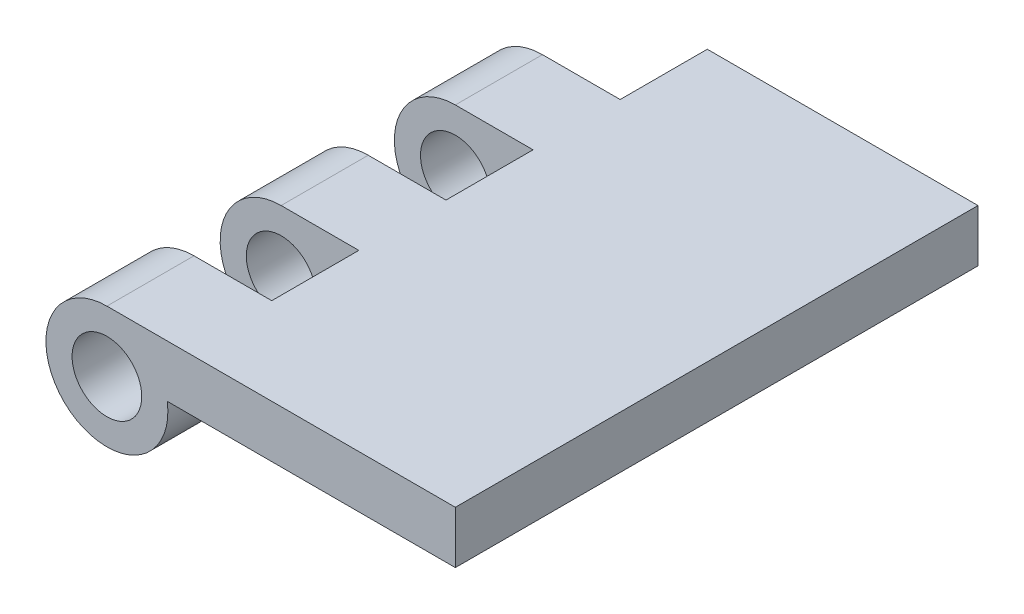
ISO-10303-21;
HEADER;
FILE_DESCRIPTION(('STEP AP214'),'2;1');
FILE_NAME('part.step','',(''),(''),'','','');
FILE_SCHEMA(('AUTOMOTIVE_DESIGN { 1 0 10303 214 1 1 1 1 }'));
ENDSEC;
DATA;
#1=APPLICATION_CONTEXT('core data for automotive mechanical design processes');
#2=APPLICATION_PROTOCOL_DEFINITION('international standard','automotive_design',2000,#1);
#3=PRODUCT_CONTEXT('',#1,'mechanical');
#4=PRODUCT('Part','Part','',(#3));
#5=PRODUCT_RELATED_PRODUCT_CATEGORY('part','',(#4));
#6=PRODUCT_DEFINITION_FORMATION('','',#4);
#7=PRODUCT_DEFINITION_CONTEXT('part definition',#1,'design');
#8=PRODUCT_DEFINITION('design','',#6,#7);
#9=PRODUCT_DEFINITION_SHAPE('','',#8);
#10=(LENGTH_UNIT() NAMED_UNIT(*) SI_UNIT(.MILLI.,.METRE.));
#11=(NAMED_UNIT(*) PLANE_ANGLE_UNIT() SI_UNIT($,.RADIAN.));
#12=(NAMED_UNIT(*) SI_UNIT($,.STERADIAN.) SOLID_ANGLE_UNIT());
#13=UNCERTAINTY_MEASURE_WITH_UNIT(LENGTH_MEASURE(1.E-05),#10,'distance_accuracy_value','');
#14=(GEOMETRIC_REPRESENTATION_CONTEXT(3) GLOBAL_UNCERTAINTY_ASSIGNED_CONTEXT((#13)) GLOBAL_UNIT_ASSIGNED_CONTEXT((#10,
#11,#12)) REPRESENTATION_CONTEXT('',''));
#15=CARTESIAN_POINT('',(0.,0.,0.));
#16=DIRECTION('',(0.,0.,1.));
#17=DIRECTION('',(1.,0.,0.));
#18=AXIS2_PLACEMENT_3D('',#15,#16,#17);
#19=CARTESIAN_POINT('',(-34.572309248939,-20.9546346070708,-23.6366244580953));
#20=DIRECTION('',(0.,0.,-1.));
#21=DIRECTION('',(1.,0.,0.));
#22=AXIS2_PLACEMENT_3D('',#19,#20,#21);
#23=PLANE('',#22);
#24=DIRECTION('',(-1.,0.,0.));
#25=VECTOR('',#24,1.);
#26=CARTESIAN_POINT('',(-14.572309248939,-20.4546346070708,-23.6366244580953));
#27=LINE('',#26,#25);
#28=CARTESIAN_POINT('',(-14.572309248939,-20.4546346070708,-23.6366244580953));
#29=VERTEX_POINT('',#28);
#30=CARTESIAN_POINT('',(-30.1116768478304,-20.4546346070708,-23.6366244580953));
#31=VERTEX_POINT('',#30);
#32=EDGE_CURVE('E252',#29,#31,#27,.T.);
#33=ORIENTED_EDGE('',*,*,#32,.T.);
#34=DIRECTION('',(0.,1.,0.));
#35=VECTOR('',#34,1.);
#36=CARTESIAN_POINT('',(-30.1116768478304,-20.9546346070708,-23.6366244580953));
#37=LINE('',#36,#35);
#38=CARTESIAN_POINT('',(-30.1116768478304,-17.4546346070708,-23.6366244580953));
#39=VERTEX_POINT('',#38);
#40=EDGE_CURVE('E231',#31,#39,#37,.T.);
#41=ORIENTED_EDGE('',*,*,#40,.T.);
#42=DIRECTION('',(1.,0.,0.));
#43=VECTOR('',#42,1.);
#44=CARTESIAN_POINT('',(-34.572309248939,-17.4546346070708,-23.6366244580953));
#45=LINE('',#44,#43);
#46=CARTESIAN_POINT('',(-14.572309248939,-17.4546346070708,-23.6366244580953));
#47=VERTEX_POINT('',#46);
#48=EDGE_CURVE('E243',#39,#47,#45,.T.);
#49=ORIENTED_EDGE('',*,*,#48,.T.);
#50=DIRECTION('',(0.,-1.,0.));
#51=VECTOR('',#50,1.);
#52=CARTESIAN_POINT('',(-14.572309248939,-17.4546346070708,-23.6366244580953));
#53=LINE('',#52,#51);
#54=EDGE_CURVE('E247',#47,#29,#53,.T.);
#55=ORIENTED_EDGE('',*,*,#54,.T.);
#56=EDGE_LOOP('',(#33,#41,#49,#55));
#57=FACE_BOUND('',#56,.T.);
#58=ADVANCED_FACE('F46',(#57),#23,.T.);
#59=CARTESIAN_POINT('',(-34.572309248939,-20.9546346070708,-23.6366244580953));
#60=DIRECTION('',(0.,0.,1.));
#61=DIRECTION('',(-1.,0.,0.));
#62=AXIS2_PLACEMENT_3D('',#59,#60,#61);
#63=CYLINDRICAL_SURFACE('',#62,3.5);
#64=CARTESIAN_POINT('',(-34.572309248939,-20.9546346070708,-18.6366244580953));
#65=DIRECTION('',(0.,0.,-1.));
#66=DIRECTION('',(1.,0.,0.));
#67=AXIS2_PLACEMENT_3D('',#64,#65,#66);
#68=CIRCLE('',#67,3.5);
#69=CARTESIAN_POINT('',(-31.1082076338012,-20.4546346070708,-18.6366244580953));
#70=VERTEX_POINT('',#69);
#71=CARTESIAN_POINT('',(-34.572309248939,-17.4546346070708,-18.6366244580953));
#72=VERTEX_POINT('',#71);
#73=EDGE_CURVE('E221',#70,#72,#68,.T.);
#74=ORIENTED_EDGE('',*,*,#73,.F.);
#75=DIRECTION('',(0.,0.,1.));
#76=VECTOR('',#75,1.);
#77=CARTESIAN_POINT('',(-31.1082076338012,-20.4546346070708,-23.6366244580953));
#78=LINE('',#77,#76);
#79=CARTESIAN_POINT('',(-31.1082076338012,-20.4546346070708,-13.6366244580953));
#80=VERTEX_POINT('',#79);
#81=EDGE_CURVE('E273',#70,#80,#78,.T.);
#82=ORIENTED_EDGE('',*,*,#81,.T.);
#83=CARTESIAN_POINT('',(-34.572309248939,-20.9546346070708,-13.6366244580953));
#84=DIRECTION('',(0.,0.,-1.));
#85=DIRECTION('',(1.,0.,0.));
#86=AXIS2_PLACEMENT_3D('',#83,#84,#85);
#87=CIRCLE('',#86,3.5);
#88=CARTESIAN_POINT('',(-34.572309248939,-17.4546346070708,-13.6366244580953));
#89=VERTEX_POINT('',#88);
#90=EDGE_CURVE('E197',#80,#89,#87,.T.);
#91=ORIENTED_EDGE('',*,*,#90,.T.);
#92=DIRECTION('',(0.,0.,1.));
#93=VECTOR('',#92,1.);
#94=CARTESIAN_POINT('',(-34.572309248939,-17.4546346070708,-23.6366244580953));
#95=LINE('',#94,#93);
#96=EDGE_CURVE('E286',#72,#89,#95,.T.);
#97=ORIENTED_EDGE('',*,*,#96,.F.);
#98=EDGE_LOOP('',(#74,#82,#91,#97));
#99=FACE_BOUND('',#98,.T.);
#100=ADVANCED_FACE('F48',(#99),#63,.T.);
#101=CARTESIAN_POINT('',(-34.572309248939,-20.9546346070708,-8.63662445809528));
#102=DIRECTION('',(0.,0.,-1.));
#103=DIRECTION('',(1.,0.,0.));
#104=AXIS2_PLACEMENT_3D('',#101,#102,#103);
#105=CIRCLE('',#104,3.5);
#106=CARTESIAN_POINT('',(-31.1082076338012,-20.4546346070708,-8.63662445809528));
#107=VERTEX_POINT('',#106);
#108=CARTESIAN_POINT('',(-34.572309248939,-17.4546346070708,-8.63662445809528));
#109=VERTEX_POINT('',#108);
#110=EDGE_CURVE('E209',#107,#109,#105,.T.);
#111=ORIENTED_EDGE('',*,*,#110,.F.);
#112=CARTESIAN_POINT('',(-31.1082076338012,-20.4546346070708,-3.63662445809528));
#113=VERTEX_POINT('',#112);
#114=EDGE_CURVE('E272',#107,#113,#78,.T.);
#115=ORIENTED_EDGE('',*,*,#114,.T.);
#116=CARTESIAN_POINT('',(-34.572309248939,-20.9546346070708,-3.63662445809528));
#117=DIRECTION('',(0.,0.,-1.));
#118=DIRECTION('',(1.,0.,0.));
#119=AXIS2_PLACEMENT_3D('',#116,#117,#118);
#120=CIRCLE('',#119,3.5);
#121=CARTESIAN_POINT('',(-34.572309248939,-17.4546346070708,-3.63662445809528));
#122=VERTEX_POINT('',#121);
#123=EDGE_CURVE('E174',#113,#122,#120,.T.);
#124=ORIENTED_EDGE('',*,*,#123,.T.);
#125=EDGE_CURVE('E170',#109,#122,#95,.T.);
#126=ORIENTED_EDGE('',*,*,#125,.F.);
#127=EDGE_LOOP('',(#111,#115,#124,#126));
#128=FACE_BOUND('',#127,.T.);
#129=ADVANCED_FACE('F343',(#128),#63,.T.);
#130=CARTESIAN_POINT('',(-34.572309248939,-20.9546346070708,1.36337554190472));
#131=DIRECTION('',(0.,0.,-1.));
#132=DIRECTION('',(1.,0.,0.));
#133=AXIS2_PLACEMENT_3D('',#130,#131,#132);
#134=CIRCLE('',#133,3.5);
#135=CARTESIAN_POINT('',(-31.1082076338012,-20.4546346070708,1.36337554190472));
#136=VERTEX_POINT('',#135);
#137=CARTESIAN_POINT('',(-34.572309248939,-17.4546346070708,1.36337554190472));
#138=VERTEX_POINT('',#137);
#139=EDGE_CURVE('E186',#136,#138,#134,.T.);
#140=ORIENTED_EDGE('',*,*,#139,.F.);
#141=CARTESIAN_POINT('',(-31.1082076338012,-20.4546346070708,6.36337554190472));
#142=VERTEX_POINT('',#141);
#143=EDGE_CURVE('E256',#136,#142,#78,.T.);
#144=ORIENTED_EDGE('',*,*,#143,.T.);
#145=CARTESIAN_POINT('',(-34.572309248939,-20.9546346070708,6.36337554190472));
#146=DIRECTION('',(0.,0.,-1.));
#147=DIRECTION('',(1.,0.,0.));
#148=AXIS2_PLACEMENT_3D('',#145,#146,#147);
#149=CIRCLE('',#148,3.5);
#150=CARTESIAN_POINT('',(-34.572309248939,-17.4546346070708,6.36337554190472));
#151=VERTEX_POINT('',#150);
#152=EDGE_CURVE('E242',#142,#151,#149,.T.);
#153=ORIENTED_EDGE('',*,*,#152,.T.);
#154=EDGE_CURVE('E282',#138,#151,#95,.T.);
#155=ORIENTED_EDGE('',*,*,#154,.F.);
#156=EDGE_LOOP('',(#140,#144,#153,#155));
#157=FACE_BOUND('',#156,.T.);
#158=ADVANCED_FACE('F345',(#157),#63,.T.);
#159=CARTESIAN_POINT('',(-34.572309248939,-17.4546346070708,-23.6366244580953));
#160=DIRECTION('',(0.,-1.,0.));
#161=DIRECTION('',(0.,0.,-1.));
#162=AXIS2_PLACEMENT_3D('',#159,#160,#161);
#163=PLANE('',#162);
#164=DIRECTION('',(1.,0.,0.));
#165=VECTOR('',#164,1.);
#166=CARTESIAN_POINT('',(-34.572309248939,-17.4546346070708,-18.6366244580953));
#167=LINE('',#166,#165);
#168=CARTESIAN_POINT('',(-30.1116768478304,-17.4546346070708,-18.6366244580953));
#169=VERTEX_POINT('',#168);
#170=EDGE_CURVE('E166',#72,#169,#167,.T.);
#171=ORIENTED_EDGE('',*,*,#170,.F.);
#172=ORIENTED_EDGE('',*,*,#96,.T.);
#173=DIRECTION('',(1.,0.,0.));
#174=VECTOR('',#173,1.);
#175=CARTESIAN_POINT('',(-34.572309248939,-17.4546346070708,-13.6366244580953));
#176=LINE('',#175,#174);
#177=CARTESIAN_POINT('',(-30.1116768478304,-17.4546346070708,-13.6366244580953));
#178=VERTEX_POINT('',#177);
#179=EDGE_CURVE('E201',#89,#178,#176,.T.);
#180=ORIENTED_EDGE('',*,*,#179,.T.);
#181=DIRECTION('',(0.,0.,-1.));
#182=VECTOR('',#181,1.);
#183=CARTESIAN_POINT('',(-30.1116768478304,-17.4546346070708,-23.6366244580953));
#184=LINE('',#183,#182);
#185=CARTESIAN_POINT('',(-30.1116768478304,-17.4546346070708,-8.63662445809528));
#186=VERTEX_POINT('',#185);
#187=EDGE_CURVE('E165',#186,#178,#184,.T.);
#188=ORIENTED_EDGE('',*,*,#187,.F.);
#189=DIRECTION('',(1.,0.,0.));
#190=VECTOR('',#189,1.);
#191=CARTESIAN_POINT('',(-34.572309248939,-17.4546346070708,-8.63662445809528));
#192=LINE('',#191,#190);
#193=EDGE_CURVE('E213',#109,#186,#192,.T.);
#194=ORIENTED_EDGE('',*,*,#193,.F.);
#195=ORIENTED_EDGE('',*,*,#125,.T.);
#196=DIRECTION('',(1.,0.,0.));
#197=VECTOR('',#196,1.);
#198=CARTESIAN_POINT('',(-34.572309248939,-17.4546346070708,-3.63662445809528));
#199=LINE('',#198,#197);
#200=CARTESIAN_POINT('',(-30.1116768478304,-17.4546346070708,-3.63662445809528));
#201=VERTEX_POINT('',#200);
#202=EDGE_CURVE('E151',#122,#201,#199,.T.);
#203=ORIENTED_EDGE('',*,*,#202,.T.);
#204=DIRECTION('',(0.,0.,-1.));
#205=VECTOR('',#204,1.);
#206=CARTESIAN_POINT('',(-30.1116768478304,-17.4546346070708,-23.6366244580953));
#207=LINE('',#206,#205);
#208=CARTESIAN_POINT('',(-30.1116768478304,-17.4546346070708,1.36337554190472));
#209=VERTEX_POINT('',#208);
#210=EDGE_CURVE('E160',#209,#201,#207,.T.);
#211=ORIENTED_EDGE('',*,*,#210,.F.);
#212=DIRECTION('',(1.,0.,0.));
#213=VECTOR('',#212,1.);
#214=CARTESIAN_POINT('',(-34.572309248939,-17.4546346070708,1.36337554190472));
#215=LINE('',#214,#213);
#216=EDGE_CURVE('E190',#138,#209,#215,.T.);
#217=ORIENTED_EDGE('',*,*,#216,.F.);
#218=ORIENTED_EDGE('',*,*,#154,.T.);
#219=DIRECTION('',(1.,0.,0.));
#220=VECTOR('',#219,1.);
#221=CARTESIAN_POINT('',(-34.572309248939,-17.4546346070708,6.36337554190472));
#222=LINE('',#221,#220);
#223=CARTESIAN_POINT('',(-14.572309248939,-17.4546346070708,6.36337554190472));
#224=VERTEX_POINT('',#223);
#225=EDGE_CURVE('E260',#151,#224,#222,.T.);
#226=ORIENTED_EDGE('',*,*,#225,.T.);
#227=DIRECTION('',(0.,0.,1.));
#228=VECTOR('',#227,1.);
#229=CARTESIAN_POINT('',(-14.572309248939,-17.4546346070708,-23.6366244580953));
#230=LINE('',#229,#228);
#231=EDGE_CURVE('E278',#47,#224,#230,.T.);
#232=ORIENTED_EDGE('',*,*,#231,.F.);
#233=ORIENTED_EDGE('',*,*,#48,.F.);
#234=DIRECTION('',(0.,0.,-1.));
#235=VECTOR('',#234,1.);
#236=CARTESIAN_POINT('',(-30.1116768478304,-17.4546346070708,-23.6366244580953));
#237=LINE('',#236,#235);
#238=EDGE_CURVE('E235',#169,#39,#237,.T.);
#239=ORIENTED_EDGE('',*,*,#238,.F.);
#240=EDGE_LOOP('',(#171,#172,#180,#188,#194,#195,#203,#211,#217,#218,#226,#232,#233,#239));
#241=FACE_BOUND('',#240,.T.);
#242=ADVANCED_FACE('F168',(#241),#163,.F.);
#243=CARTESIAN_POINT('',(-14.572309248939,-20.4546346070708,-23.6366244580953));
#244=DIRECTION('',(0.,1.,0.));
#245=DIRECTION('',(1.,0.,0.));
#246=AXIS2_PLACEMENT_3D('',#243,#244,#245);
#247=PLANE('',#246);
#248=DIRECTION('',(-1.,0.,0.));
#249=VECTOR('',#248,1.);
#250=CARTESIAN_POINT('',(-14.572309248939,-20.4546346070708,-18.6366244580953));
#251=LINE('',#250,#249);
#252=CARTESIAN_POINT('',(-30.1116768478304,-20.4546346070708,-18.6366244580953));
#253=VERTEX_POINT('',#252);
#254=EDGE_CURVE('E218',#253,#70,#251,.T.);
#255=ORIENTED_EDGE('',*,*,#254,.F.);
#256=DIRECTION('',(0.,0.,1.));
#257=VECTOR('',#256,1.);
#258=CARTESIAN_POINT('',(-30.1116768478304,-20.4546346070708,-23.6366244580953));
#259=LINE('',#258,#257);
#260=EDGE_CURVE('E11',#31,#253,#259,.T.);
#261=ORIENTED_EDGE('',*,*,#260,.F.);
#262=ORIENTED_EDGE('',*,*,#32,.F.);
#263=DIRECTION('',(0.,0.,1.));
#264=VECTOR('',#263,1.);
#265=CARTESIAN_POINT('',(-14.572309248939,-20.4546346070708,-23.6366244580953));
#266=LINE('',#265,#264);
#267=CARTESIAN_POINT('',(-14.572309248939,-20.4546346070708,6.36337554190472));
#268=VERTEX_POINT('',#267);
#269=EDGE_CURVE('E274',#29,#268,#266,.T.);
#270=ORIENTED_EDGE('',*,*,#269,.T.);
#271=DIRECTION('',(-1.,0.,0.));
#272=VECTOR('',#271,1.);
#273=CARTESIAN_POINT('',(-14.572309248939,-20.4546346070708,6.36337554190472));
#274=LINE('',#273,#272);
#275=EDGE_CURVE('E248',#268,#142,#274,.T.);
#276=ORIENTED_EDGE('',*,*,#275,.T.);
#277=ORIENTED_EDGE('',*,*,#143,.F.);
#278=DIRECTION('',(-1.,0.,0.));
#279=VECTOR('',#278,1.);
#280=CARTESIAN_POINT('',(-14.572309248939,-20.4546346070708,1.36337554190472));
#281=LINE('',#280,#279);
#282=CARTESIAN_POINT('',(-30.1116768478304,-20.4546346070708,1.36337554190472));
#283=VERTEX_POINT('',#282);
#284=EDGE_CURVE('E179',#283,#136,#281,.T.);
#285=ORIENTED_EDGE('',*,*,#284,.F.);
#286=DIRECTION('',(0.,0.,1.));
#287=VECTOR('',#286,1.);
#288=CARTESIAN_POINT('',(-30.1116768478304,-20.4546346070708,-23.6366244580953));
#289=LINE('',#288,#287);
#290=CARTESIAN_POINT('',(-30.1116768478304,-20.4546346070708,-3.63662445809528));
#291=VERTEX_POINT('',#290);
#292=EDGE_CURVE('E301',#291,#283,#289,.T.);
#293=ORIENTED_EDGE('',*,*,#292,.F.);
#294=DIRECTION('',(-1.,0.,0.));
#295=VECTOR('',#294,1.);
#296=CARTESIAN_POINT('',(-14.572309248939,-20.4546346070708,-3.63662445809528));
#297=LINE('',#296,#295);
#298=EDGE_CURVE('E67',#291,#113,#297,.T.);
#299=ORIENTED_EDGE('',*,*,#298,.T.);
#300=ORIENTED_EDGE('',*,*,#114,.F.);
#301=DIRECTION('',(-1.,0.,0.));
#302=VECTOR('',#301,1.);
#303=CARTESIAN_POINT('',(-14.572309248939,-20.4546346070708,-8.63662445809528));
#304=LINE('',#303,#302);
#305=CARTESIAN_POINT('',(-30.1116768478304,-20.4546346070708,-8.63662445809528));
#306=VERTEX_POINT('',#305);
#307=EDGE_CURVE('E206',#306,#107,#304,.T.);
#308=ORIENTED_EDGE('',*,*,#307,.F.);
#309=DIRECTION('',(0.,0.,1.));
#310=VECTOR('',#309,1.);
#311=CARTESIAN_POINT('',(-30.1116768478304,-20.4546346070708,-23.6366244580953));
#312=LINE('',#311,#310);
#313=CARTESIAN_POINT('',(-30.1116768478304,-20.4546346070708,-13.6366244580953));
#314=VERTEX_POINT('',#313);
#315=EDGE_CURVE('E55',#314,#306,#312,.T.);
#316=ORIENTED_EDGE('',*,*,#315,.F.);
#317=DIRECTION('',(-1.,0.,0.));
#318=VECTOR('',#317,1.);
#319=CARTESIAN_POINT('',(-14.572309248939,-20.4546346070708,-13.6366244580953));
#320=LINE('',#319,#318);
#321=EDGE_CURVE('E194',#314,#80,#320,.T.);
#322=ORIENTED_EDGE('',*,*,#321,.T.);
#323=ORIENTED_EDGE('',*,*,#81,.F.);
#324=EDGE_LOOP('',(#255,#261,#262,#270,#276,#277,#285,#293,#299,#300,#308,#316,#322,#323));
#325=FACE_BOUND('',#324,.T.);
#326=ADVANCED_FACE('F311',(#325),#247,.F.);
#327=CARTESIAN_POINT('',(-34.572309248939,-20.9546346070708,-23.6366244580953));
#328=DIRECTION('',(0.,0.,1.));
#329=DIRECTION('',(-1.,0.,0.));
#330=AXIS2_PLACEMENT_3D('',#327,#328,#329);
#331=CYLINDRICAL_SURFACE('',#330,2.);
#332=CARTESIAN_POINT('',(-34.572309248939,-20.9546346070708,6.36337554190472));
#333=DIRECTION('',(0.,0.,-1.));
#334=DIRECTION('',(1.,0.,0.));
#335=AXIS2_PLACEMENT_3D('',#332,#333,#334);
#336=CIRCLE('',#335,2.);
#337=CARTESIAN_POINT('',(-32.572309248939,-20.9546346070708,6.36337554190472));
#338=VERTEX_POINT('',#337);
#339=EDGE_CURVE('E238',#338,#338,#336,.T.);
#340=ORIENTED_EDGE('',*,*,#339,.F.);
#341=EDGE_LOOP('',(#340));
#342=FACE_BOUND('',#341,.T.);
#343=CARTESIAN_POINT('',(-34.572309248939,-20.9546346070708,1.36337554190472));
#344=DIRECTION('',(0.,0.,-1.));
#345=DIRECTION('',(1.,0.,0.));
#346=AXIS2_PLACEMENT_3D('',#343,#344,#345);
#347=CIRCLE('',#346,2.);
#348=CARTESIAN_POINT('',(-32.572309248939,-20.9546346070708,1.36337554190472));
#349=VERTEX_POINT('',#348);
#350=EDGE_CURVE('E173',#349,#349,#347,.T.);
#351=ORIENTED_EDGE('',*,*,#350,.T.);
#352=EDGE_LOOP('',(#351));
#353=FACE_BOUND('',#352,.T.);
#354=ADVANCED_FACE('F364',(#342,#353),#331,.F.);
#355=CARTESIAN_POINT('',(-34.572309248939,-20.9546346070708,6.36337554190472));
#356=DIRECTION('',(0.,0.,-1.));
#357=DIRECTION('',(1.,0.,0.));
#358=AXIS2_PLACEMENT_3D('',#355,#356,#357);
#359=PLANE('',#358);
#360=ORIENTED_EDGE('',*,*,#152,.F.);
#361=ORIENTED_EDGE('',*,*,#275,.F.);
#362=DIRECTION('',(0.,-1.,0.));
#363=VECTOR('',#362,1.);
#364=CARTESIAN_POINT('',(-14.572309248939,-17.4546346070708,6.36337554190472));
#365=LINE('',#364,#363);
#366=EDGE_CURVE('E264',#224,#268,#365,.T.);
#367=ORIENTED_EDGE('',*,*,#366,.F.);
#368=ORIENTED_EDGE('',*,*,#225,.F.);
#369=EDGE_LOOP('',(#360,#361,#367,#368));
#370=FACE_BOUND('',#369,.T.);
#371=ORIENTED_EDGE('',*,*,#339,.T.);
#372=EDGE_LOOP('',(#371));
#373=FACE_BOUND('',#372,.T.);
#374=ADVANCED_FACE('F360',(#370,#373),#359,.F.);
#375=CARTESIAN_POINT('',(-14.572309248939,-17.4546346070708,-23.6366244580953));
#376=DIRECTION('',(-1.,0.,0.));
#377=DIRECTION('',(0.,0.,-1.));
#378=AXIS2_PLACEMENT_3D('',#375,#376,#377);
#379=PLANE('',#378);
#380=ORIENTED_EDGE('',*,*,#366,.T.);
#381=ORIENTED_EDGE('',*,*,#269,.F.);
#382=ORIENTED_EDGE('',*,*,#54,.F.);
#383=ORIENTED_EDGE('',*,*,#231,.T.);
#384=EDGE_LOOP('',(#380,#381,#382,#383));
#385=FACE_BOUND('',#384,.T.);
#386=ADVANCED_FACE('F363',(#385),#379,.F.);
#387=CARTESIAN_POINT('',(-30.1116768478304,-5.95463460707083,1.36337554190472));
#388=DIRECTION('',(-1.,0.,0.));
#389=DIRECTION('',(0.,0.,-1.));
#390=AXIS2_PLACEMENT_3D('',#387,#388,#389);
#391=PLANE('',#390);
#392=ORIENTED_EDGE('',*,*,#210,.T.);
#393=DIRECTION('',(0.,-1.,0.));
#394=VECTOR('',#393,1.);
#395=CARTESIAN_POINT('',(-30.1116768478304,-5.95463460707083,-3.63662445809528));
#396=LINE('',#395,#394);
#397=EDGE_CURVE('E147',#201,#291,#396,.T.);
#398=ORIENTED_EDGE('',*,*,#397,.T.);
#399=ORIENTED_EDGE('',*,*,#292,.T.);
#400=DIRECTION('',(0.,-1.,0.));
#401=VECTOR('',#400,1.);
#402=CARTESIAN_POINT('',(-30.1116768478304,-5.95463460707083,1.36337554190472));
#403=LINE('',#402,#401);
#404=EDGE_CURVE('E157',#209,#283,#403,.T.);
#405=ORIENTED_EDGE('',*,*,#404,.F.);
#406=EDGE_LOOP('',(#392,#398,#399,#405));
#407=FACE_BOUND('',#406,.T.);
#408=ADVANCED_FACE('F161',(#407),#391,.T.);
#409=CARTESIAN_POINT('',(-41.3588423807102,-5.95463460707083,1.36337554190472));
#410=DIRECTION('',(0.,0.,-1.));
#411=DIRECTION('',(1.,0.,0.));
#412=AXIS2_PLACEMENT_3D('',#409,#410,#411);
#413=PLANE('',#412);
#414=ORIENTED_EDGE('',*,*,#350,.F.);
#415=EDGE_LOOP('',(#414));
#416=FACE_BOUND('',#415,.T.);
#417=ORIENTED_EDGE('',*,*,#216,.T.);
#418=ORIENTED_EDGE('',*,*,#404,.T.);
#419=ORIENTED_EDGE('',*,*,#284,.T.);
#420=ORIENTED_EDGE('',*,*,#139,.T.);
#421=EDGE_LOOP('',(#417,#418,#419,#420));
#422=FACE_BOUND('',#421,.T.);
#423=ADVANCED_FACE('F400',(#416,#422),#413,.T.);
#424=CARTESIAN_POINT('',(-41.3588423807102,-5.95463460707083,-3.63662445809528));
#425=DIRECTION('',(0.,0.,-1.));
#426=DIRECTION('',(1.,0.,0.));
#427=AXIS2_PLACEMENT_3D('',#424,#425,#426);
#428=PLANE('',#427);
#429=CARTESIAN_POINT('',(-34.572309248939,-20.9546346070708,-3.63662445809528));
#430=DIRECTION('',(0.,0.,-1.));
#431=DIRECTION('',(1.,0.,0.));
#432=AXIS2_PLACEMENT_3D('',#429,#430,#431);
#433=CIRCLE('',#432,2.);
#434=CARTESIAN_POINT('',(-32.572309248939,-20.9546346070708,-3.63662445809528));
#435=VERTEX_POINT('',#434);
#436=EDGE_CURVE('E287',#435,#435,#433,.T.);
#437=ORIENTED_EDGE('',*,*,#436,.T.);
#438=EDGE_LOOP('',(#437));
#439=FACE_BOUND('',#438,.T.);
#440=ORIENTED_EDGE('',*,*,#123,.F.);
#441=ORIENTED_EDGE('',*,*,#298,.F.);
#442=ORIENTED_EDGE('',*,*,#397,.F.);
#443=ORIENTED_EDGE('',*,*,#202,.F.);
#444=EDGE_LOOP('',(#440,#441,#442,#443));
#445=FACE_BOUND('',#444,.T.);
#446=ADVANCED_FACE('F149',(#439,#445),#428,.F.);
#447=CARTESIAN_POINT('',(-30.1116768478304,-5.95463460707083,-8.63662445809528));
#448=DIRECTION('',(-1.,0.,0.));
#449=DIRECTION('',(0.,0.,-1.));
#450=AXIS2_PLACEMENT_3D('',#447,#448,#449);
#451=PLANE('',#450);
#452=ORIENTED_EDGE('',*,*,#187,.T.);
#453=DIRECTION('',(0.,-1.,0.));
#454=VECTOR('',#453,1.);
#455=CARTESIAN_POINT('',(-30.1116768478304,-5.95463460707083,-13.6366244580953));
#456=LINE('',#455,#454);
#457=EDGE_CURVE('E309',#178,#314,#456,.T.);
#458=ORIENTED_EDGE('',*,*,#457,.T.);
#459=ORIENTED_EDGE('',*,*,#315,.T.);
#460=DIRECTION('',(0.,-1.,0.));
#461=VECTOR('',#460,1.);
#462=CARTESIAN_POINT('',(-30.1116768478304,-5.95463460707083,-8.63662445809528));
#463=LINE('',#462,#461);
#464=EDGE_CURVE('E156',#186,#306,#463,.T.);
#465=ORIENTED_EDGE('',*,*,#464,.F.);
#466=EDGE_LOOP('',(#452,#458,#459,#465));
#467=FACE_BOUND('',#466,.T.);
#468=ADVANCED_FACE('F308',(#467),#451,.T.);
#469=CARTESIAN_POINT('',(-41.3588423807102,-5.95463460707083,-8.63662445809528));
#470=DIRECTION('',(0.,0.,-1.));
#471=DIRECTION('',(1.,0.,0.));
#472=AXIS2_PLACEMENT_3D('',#469,#470,#471);
#473=PLANE('',#472);
#474=CARTESIAN_POINT('',(-34.572309248939,-20.9546346070708,-8.63662445809528));
#475=DIRECTION('',(0.,0.,-1.));
#476=DIRECTION('',(1.,0.,0.));
#477=AXIS2_PLACEMENT_3D('',#474,#475,#476);
#478=CIRCLE('',#477,2.);
#479=CARTESIAN_POINT('',(-32.572309248939,-20.9546346070708,-8.63662445809528));
#480=VERTEX_POINT('',#479);
#481=EDGE_CURVE('E205',#480,#480,#478,.T.);
#482=ORIENTED_EDGE('',*,*,#481,.F.);
#483=EDGE_LOOP('',(#482));
#484=FACE_BOUND('',#483,.T.);
#485=ORIENTED_EDGE('',*,*,#193,.T.);
#486=ORIENTED_EDGE('',*,*,#464,.T.);
#487=ORIENTED_EDGE('',*,*,#307,.T.);
#488=ORIENTED_EDGE('',*,*,#110,.T.);
#489=EDGE_LOOP('',(#485,#486,#487,#488));
#490=FACE_BOUND('',#489,.T.);
#491=ADVANCED_FACE('F315',(#484,#490),#473,.T.);
#492=CARTESIAN_POINT('',(-41.3588423807102,-5.95463460707083,-13.6366244580953));
#493=DIRECTION('',(0.,0.,-1.));
#494=DIRECTION('',(1.,0.,0.));
#495=AXIS2_PLACEMENT_3D('',#492,#493,#494);
#496=PLANE('',#495);
#497=CARTESIAN_POINT('',(-34.572309248939,-20.9546346070708,-13.6366244580953));
#498=DIRECTION('',(0.,0.,-1.));
#499=DIRECTION('',(1.,0.,0.));
#500=AXIS2_PLACEMENT_3D('',#497,#498,#499);
#501=CIRCLE('',#500,2.);
#502=CARTESIAN_POINT('',(-32.572309248939,-20.9546346070708,-13.6366244580953));
#503=VERTEX_POINT('',#502);
#504=EDGE_CURVE('E193',#503,#503,#501,.T.);
#505=ORIENTED_EDGE('',*,*,#504,.T.);
#506=EDGE_LOOP('',(#505));
#507=FACE_BOUND('',#506,.T.);
#508=ORIENTED_EDGE('',*,*,#90,.F.);
#509=ORIENTED_EDGE('',*,*,#321,.F.);
#510=ORIENTED_EDGE('',*,*,#457,.F.);
#511=ORIENTED_EDGE('',*,*,#179,.F.);
#512=EDGE_LOOP('',(#508,#509,#510,#511));
#513=FACE_BOUND('',#512,.T.);
#514=ADVANCED_FACE('F426',(#507,#513),#496,.F.);
#515=CARTESIAN_POINT('',(-30.1116768478304,-5.95463460707083,-18.6366244580953));
#516=DIRECTION('',(-1.,0.,0.));
#517=DIRECTION('',(0.,0.,-1.));
#518=AXIS2_PLACEMENT_3D('',#515,#516,#517);
#519=PLANE('',#518);
#520=ORIENTED_EDGE('',*,*,#238,.T.);
#521=ORIENTED_EDGE('',*,*,#40,.F.);
#522=ORIENTED_EDGE('',*,*,#260,.T.);
#523=DIRECTION('',(0.,-1.,0.));
#524=VECTOR('',#523,1.);
#525=CARTESIAN_POINT('',(-30.1116768478304,-5.95463460707083,-18.6366244580953));
#526=LINE('',#525,#524);
#527=EDGE_CURVE('E290',#169,#253,#526,.T.);
#528=ORIENTED_EDGE('',*,*,#527,.F.);
#529=EDGE_LOOP('',(#520,#521,#522,#528));
#530=FACE_BOUND('',#529,.T.);
#531=ADVANCED_FACE('F331',(#530),#519,.T.);
#532=CARTESIAN_POINT('',(-43.1325889163615,-5.95463460707083,-18.6366244580953));
#533=DIRECTION('',(0.,0.,-1.));
#534=DIRECTION('',(1.,0.,0.));
#535=AXIS2_PLACEMENT_3D('',#532,#533,#534);
#536=PLANE('',#535);
#537=CARTESIAN_POINT('',(-34.572309248939,-20.9546346070708,-18.6366244580953));
#538=DIRECTION('',(0.,0.,-1.));
#539=DIRECTION('',(1.,0.,0.));
#540=AXIS2_PLACEMENT_3D('',#537,#538,#539);
#541=CIRCLE('',#540,2.);
#542=CARTESIAN_POINT('',(-32.572309248939,-20.9546346070708,-18.6366244580953));
#543=VERTEX_POINT('',#542);
#544=EDGE_CURVE('E217',#543,#543,#541,.T.);
#545=ORIENTED_EDGE('',*,*,#544,.F.);
#546=EDGE_LOOP('',(#545));
#547=FACE_BOUND('',#546,.T.);
#548=ORIENTED_EDGE('',*,*,#170,.T.);
#549=ORIENTED_EDGE('',*,*,#527,.T.);
#550=ORIENTED_EDGE('',*,*,#254,.T.);
#551=ORIENTED_EDGE('',*,*,#73,.T.);
#552=EDGE_LOOP('',(#548,#549,#550,#551));
#553=FACE_BOUND('',#552,.T.);
#554=ADVANCED_FACE('F327',(#547,#553),#536,.T.);
#555=ORIENTED_EDGE('',*,*,#436,.F.);
#556=EDGE_LOOP('',(#555));
#557=FACE_BOUND('',#556,.T.);
#558=ORIENTED_EDGE('',*,*,#481,.T.);
#559=EDGE_LOOP('',(#558));
#560=FACE_BOUND('',#559,.T.);
#561=ADVANCED_FACE('F385',(#557,#560),#331,.F.);
#562=ORIENTED_EDGE('',*,*,#504,.F.);
#563=EDGE_LOOP('',(#562));
#564=FACE_BOUND('',#563,.T.);
#565=ORIENTED_EDGE('',*,*,#544,.T.);
#566=EDGE_LOOP('',(#565));
#567=FACE_BOUND('',#566,.T.);
#568=ADVANCED_FACE('F358',(#564,#567),#331,.F.);
#569=CLOSED_SHELL('',(#58,#100,#129,#158,#242,#326,#354,#374,#386,#408,#423,#446,#468,#491,#514,
#531,#554,#561,#568));
#570=MANIFOLD_SOLID_BREP('B2',#569);
#571=ADVANCED_BREP_SHAPE_REPRESENTATION('',(#18,#570),#14);
#572=SHAPE_DEFINITION_REPRESENTATION(#9,#571);
ENDSEC;
END-ISO-10303-21;
